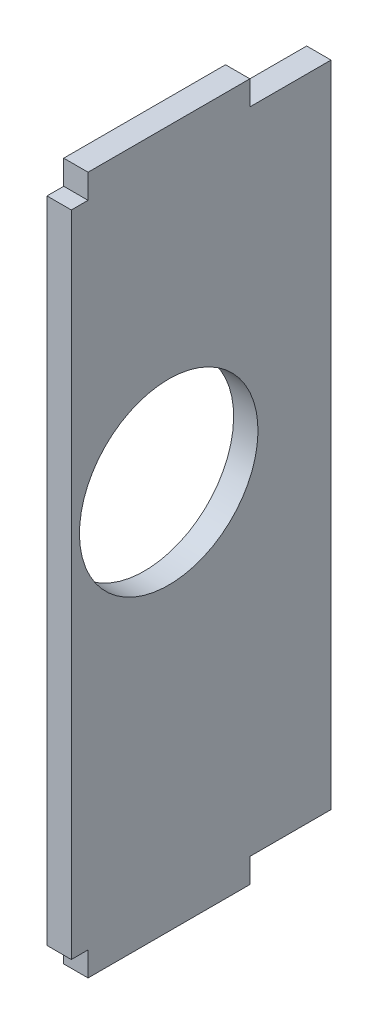
ISO-10303-21;
HEADER;
FILE_DESCRIPTION(('STEP AP214'),'2;1');
FILE_NAME('part.step','',(''),(''),'','','');
FILE_SCHEMA(('AUTOMOTIVE_DESIGN { 1 0 10303 214 1 1 1 1 }'));
ENDSEC;
DATA;
#1=APPLICATION_CONTEXT('core data for automotive mechanical design processes');
#2=APPLICATION_PROTOCOL_DEFINITION('international standard','automotive_design',2000,#1);
#3=PRODUCT_CONTEXT('',#1,'mechanical');
#4=PRODUCT('Part','Part','',(#3));
#5=PRODUCT_RELATED_PRODUCT_CATEGORY('part','',(#4));
#6=PRODUCT_DEFINITION_FORMATION('','',#4);
#7=PRODUCT_DEFINITION_CONTEXT('part definition',#1,'design');
#8=PRODUCT_DEFINITION('design','',#6,#7);
#9=PRODUCT_DEFINITION_SHAPE('','',#8);
#10=(LENGTH_UNIT() NAMED_UNIT(*) SI_UNIT(.MILLI.,.METRE.));
#11=(NAMED_UNIT(*) PLANE_ANGLE_UNIT() SI_UNIT($,.RADIAN.));
#12=(NAMED_UNIT(*) SI_UNIT($,.STERADIAN.) SOLID_ANGLE_UNIT());
#13=UNCERTAINTY_MEASURE_WITH_UNIT(LENGTH_MEASURE(1.E-05),#10,'distance_accuracy_value','');
#14=(GEOMETRIC_REPRESENTATION_CONTEXT(3) GLOBAL_UNCERTAINTY_ASSIGNED_CONTEXT((#13)) GLOBAL_UNIT_ASSIGNED_CONTEXT((#10,
#11,#12)) REPRESENTATION_CONTEXT('',''));
#15=CARTESIAN_POINT('',(0.,0.,0.));
#16=DIRECTION('',(0.,0.,1.));
#17=DIRECTION('',(1.,0.,0.));
#18=AXIS2_PLACEMENT_3D('',#15,#16,#17);
#19=CARTESIAN_POINT('',(-3.,-40.,-6.79150579150582));
#20=DIRECTION('',(0.,0.,-1.));
#21=DIRECTION('',(-1.,0.,0.));
#22=AXIS2_PLACEMENT_3D('',#19,#20,#21);
#23=PLANE('',#22);
#24=DIRECTION('',(0.,1.,0.));
#25=VECTOR('',#24,1.);
#26=CARTESIAN_POINT('',(0.,-40.,-6.79150579150582));
#27=LINE('',#26,#25);
#28=CARTESIAN_POINT('',(0.,-40.,-6.79150579150582));
#29=VERTEX_POINT('',#28);
#30=CARTESIAN_POINT('',(0.,40.,-6.79150579150582));
#31=VERTEX_POINT('',#30);
#32=EDGE_CURVE('E149',#29,#31,#27,.T.);
#33=ORIENTED_EDGE('',*,*,#32,.F.);
#34=DIRECTION('',(1.,0.,0.));
#35=VECTOR('',#34,1.);
#36=CARTESIAN_POINT('',(-3.,-40.,-6.79150579150582));
#37=LINE('',#36,#35);
#38=CARTESIAN_POINT('',(-3.,-40.,-6.79150579150582));
#39=VERTEX_POINT('',#38);
#40=EDGE_CURVE('E32',#39,#29,#37,.T.);
#41=ORIENTED_EDGE('',*,*,#40,.F.);
#42=DIRECTION('',(0.,1.,0.));
#43=VECTOR('',#42,1.);
#44=CARTESIAN_POINT('',(-3.,-40.,-6.79150579150582));
#45=LINE('',#44,#43);
#46=CARTESIAN_POINT('',(-3.,40.,-6.79150579150582));
#47=VERTEX_POINT('',#46);
#48=EDGE_CURVE('E138',#39,#47,#45,.T.);
#49=ORIENTED_EDGE('',*,*,#48,.T.);
#50=DIRECTION('',(1.,0.,0.));
#51=VECTOR('',#50,1.);
#52=CARTESIAN_POINT('',(-3.,40.,-6.79150579150582));
#53=LINE('',#52,#51);
#54=EDGE_CURVE('E10',#47,#31,#53,.T.);
#55=ORIENTED_EDGE('',*,*,#54,.T.);
#56=EDGE_LOOP('',(#33,#41,#49,#55));
#57=FACE_BOUND('',#56,.T.);
#58=ADVANCED_FACE('F16',(#57),#23,.T.);
#59=CARTESIAN_POINT('',(-3.,40.,-6.79150579150582));
#60=DIRECTION('',(0.,1.,0.));
#61=DIRECTION('',(0.,0.,1.));
#62=AXIS2_PLACEMENT_3D('',#59,#60,#61);
#63=PLANE('',#62);
#64=DIRECTION('',(0.,0.,1.));
#65=VECTOR('',#64,1.);
#66=CARTESIAN_POINT('',(0.,40.,-6.79150579150582));
#67=LINE('',#66,#65);
#68=CARTESIAN_POINT('',(0.,40.,3.2084942084942));
#69=VERTEX_POINT('',#68);
#70=EDGE_CURVE('E144',#31,#69,#67,.T.);
#71=ORIENTED_EDGE('',*,*,#70,.F.);
#72=ORIENTED_EDGE('',*,*,#54,.F.);
#73=DIRECTION('',(0.,0.,1.));
#74=VECTOR('',#73,1.);
#75=CARTESIAN_POINT('',(-3.,40.,-6.79150579150582));
#76=LINE('',#75,#74);
#77=CARTESIAN_POINT('',(-3.,40.,3.2084942084942));
#78=VERTEX_POINT('',#77);
#79=EDGE_CURVE('E140',#47,#78,#76,.T.);
#80=ORIENTED_EDGE('',*,*,#79,.T.);
#81=DIRECTION('',(1.,0.,0.));
#82=VECTOR('',#81,1.);
#83=CARTESIAN_POINT('',(-3.,40.,3.2084942084942));
#84=LINE('',#83,#82);
#85=EDGE_CURVE('E24',#78,#69,#84,.T.);
#86=ORIENTED_EDGE('',*,*,#85,.T.);
#87=EDGE_LOOP('',(#71,#72,#80,#86));
#88=FACE_BOUND('',#87,.T.);
#89=ADVANCED_FACE('F206',(#88),#63,.T.);
#90=CARTESIAN_POINT('',(-3.,40.,3.2084942084942));
#91=DIRECTION('',(0.,0.,-1.));
#92=DIRECTION('',(-1.,0.,0.));
#93=AXIS2_PLACEMENT_3D('',#90,#91,#92);
#94=PLANE('',#93);
#95=DIRECTION('',(0.,1.,0.));
#96=VECTOR('',#95,1.);
#97=CARTESIAN_POINT('',(0.,40.,3.2084942084942));
#98=LINE('',#97,#96);
#99=CARTESIAN_POINT('',(0.,43.,3.2084942084942));
#100=VERTEX_POINT('',#99);
#101=EDGE_CURVE('E148',#69,#100,#98,.T.);
#102=ORIENTED_EDGE('',*,*,#101,.F.);
#103=ORIENTED_EDGE('',*,*,#85,.F.);
#104=DIRECTION('',(0.,1.,0.));
#105=VECTOR('',#104,1.);
#106=CARTESIAN_POINT('',(-3.,40.,3.2084942084942));
#107=LINE('',#106,#105);
#108=CARTESIAN_POINT('',(-3.,43.,3.2084942084942));
#109=VERTEX_POINT('',#108);
#110=EDGE_CURVE('E216',#78,#109,#107,.T.);
#111=ORIENTED_EDGE('',*,*,#110,.T.);
#112=DIRECTION('',(1.,0.,0.));
#113=VECTOR('',#112,1.);
#114=CARTESIAN_POINT('',(-3.,43.,3.2084942084942));
#115=LINE('',#114,#113);
#116=EDGE_CURVE('E204',#109,#100,#115,.T.);
#117=ORIENTED_EDGE('',*,*,#116,.T.);
#118=EDGE_LOOP('',(#102,#103,#111,#117));
#119=FACE_BOUND('',#118,.T.);
#120=ADVANCED_FACE('F210',(#119),#94,.T.);
#121=CARTESIAN_POINT('',(-3.,43.,3.2084942084942));
#122=DIRECTION('',(0.,1.,0.));
#123=DIRECTION('',(0.,0.,1.));
#124=AXIS2_PLACEMENT_3D('',#121,#122,#123);
#125=PLANE('',#124);
#126=DIRECTION('',(0.,0.,1.));
#127=VECTOR('',#126,1.);
#128=CARTESIAN_POINT('',(0.,43.,3.2084942084942));
#129=LINE('',#128,#127);
#130=CARTESIAN_POINT('',(0.,43.,23.1484942084942));
#131=VERTEX_POINT('',#130);
#132=EDGE_CURVE('E153',#100,#131,#129,.T.);
#133=ORIENTED_EDGE('',*,*,#132,.F.);
#134=ORIENTED_EDGE('',*,*,#116,.F.);
#135=DIRECTION('',(0.,0.,1.));
#136=VECTOR('',#135,1.);
#137=CARTESIAN_POINT('',(-3.,43.,3.2084942084942));
#138=LINE('',#137,#136);
#139=CARTESIAN_POINT('',(-3.,43.,23.1484942084942));
#140=VERTEX_POINT('',#139);
#141=EDGE_CURVE('E218',#109,#140,#138,.T.);
#142=ORIENTED_EDGE('',*,*,#141,.T.);
#143=DIRECTION('',(1.,0.,0.));
#144=VECTOR('',#143,1.);
#145=CARTESIAN_POINT('',(-3.,43.,23.1484942084942));
#146=LINE('',#145,#144);
#147=EDGE_CURVE('E202',#140,#131,#146,.T.);
#148=ORIENTED_EDGE('',*,*,#147,.T.);
#149=EDGE_LOOP('',(#133,#134,#142,#148));
#150=FACE_BOUND('',#149,.T.);
#151=ADVANCED_FACE('F254',(#150),#125,.T.);
#152=CARTESIAN_POINT('',(-3.,43.,23.1484942084942));
#153=DIRECTION('',(0.,0.,1.));
#154=DIRECTION('',(1.,0.,0.));
#155=AXIS2_PLACEMENT_3D('',#152,#153,#154);
#156=PLANE('',#155);
#157=DIRECTION('',(0.,-1.,0.));
#158=VECTOR('',#157,1.);
#159=CARTESIAN_POINT('',(0.,43.,23.1484942084942));
#160=LINE('',#159,#158);
#161=CARTESIAN_POINT('',(0.,40.,23.1484942084942));
#162=VERTEX_POINT('',#161);
#163=EDGE_CURVE('E157',#131,#162,#160,.T.);
#164=ORIENTED_EDGE('',*,*,#163,.F.);
#165=ORIENTED_EDGE('',*,*,#147,.F.);
#166=DIRECTION('',(0.,-1.,0.));
#167=VECTOR('',#166,1.);
#168=CARTESIAN_POINT('',(-3.,43.,23.1484942084942));
#169=LINE('',#168,#167);
#170=CARTESIAN_POINT('',(-3.,40.,23.1484942084942));
#171=VERTEX_POINT('',#170);
#172=EDGE_CURVE('E223',#140,#171,#169,.T.);
#173=ORIENTED_EDGE('',*,*,#172,.T.);
#174=DIRECTION('',(1.,0.,0.));
#175=VECTOR('',#174,1.);
#176=CARTESIAN_POINT('',(-3.,40.,23.1484942084942));
#177=LINE('',#176,#175);
#178=EDGE_CURVE('E200',#171,#162,#177,.T.);
#179=ORIENTED_EDGE('',*,*,#178,.T.);
#180=EDGE_LOOP('',(#164,#165,#173,#179));
#181=FACE_BOUND('',#180,.T.);
#182=ADVANCED_FACE('F252',(#181),#156,.T.);
#183=CARTESIAN_POINT('',(-3.,40.,23.1484942084942));
#184=DIRECTION('',(0.,1.,0.));
#185=DIRECTION('',(0.,0.,1.));
#186=AXIS2_PLACEMENT_3D('',#183,#184,#185);
#187=PLANE('',#186);
#188=DIRECTION('',(0.,0.,1.));
#189=VECTOR('',#188,1.);
#190=CARTESIAN_POINT('',(0.,40.,23.1484942084942));
#191=LINE('',#190,#189);
#192=CARTESIAN_POINT('',(0.,40.,25.2084942084942));
#193=VERTEX_POINT('',#192);
#194=EDGE_CURVE('E161',#162,#193,#191,.T.);
#195=ORIENTED_EDGE('',*,*,#194,.F.);
#196=ORIENTED_EDGE('',*,*,#178,.F.);
#197=DIRECTION('',(0.,0.,1.));
#198=VECTOR('',#197,1.);
#199=CARTESIAN_POINT('',(-3.,40.,23.1484942084942));
#200=LINE('',#199,#198);
#201=CARTESIAN_POINT('',(-3.,40.,25.2084942084942));
#202=VERTEX_POINT('',#201);
#203=EDGE_CURVE('E226',#171,#202,#200,.T.);
#204=ORIENTED_EDGE('',*,*,#203,.T.);
#205=DIRECTION('',(1.,0.,0.));
#206=VECTOR('',#205,1.);
#207=CARTESIAN_POINT('',(-3.,40.,25.2084942084942));
#208=LINE('',#207,#206);
#209=EDGE_CURVE('E198',#202,#193,#208,.T.);
#210=ORIENTED_EDGE('',*,*,#209,.T.);
#211=EDGE_LOOP('',(#195,#196,#204,#210));
#212=FACE_BOUND('',#211,.T.);
#213=ADVANCED_FACE('F248',(#212),#187,.T.);
#214=CARTESIAN_POINT('',(-3.,40.,25.2084942084942));
#215=DIRECTION('',(0.,0.,1.));
#216=DIRECTION('',(0.,-1.,0.));
#217=AXIS2_PLACEMENT_3D('',#214,#215,#216);
#218=PLANE('',#217);
#219=DIRECTION('',(0.,-1.,0.));
#220=VECTOR('',#219,1.);
#221=CARTESIAN_POINT('',(0.,40.,25.2084942084942));
#222=LINE('',#221,#220);
#223=CARTESIAN_POINT('',(0.,-40.,25.2084942084942));
#224=VERTEX_POINT('',#223);
#225=EDGE_CURVE('E165',#193,#224,#222,.T.);
#226=ORIENTED_EDGE('',*,*,#225,.F.);
#227=ORIENTED_EDGE('',*,*,#209,.F.);
#228=DIRECTION('',(0.,-1.,0.));
#229=VECTOR('',#228,1.);
#230=CARTESIAN_POINT('',(-3.,40.,25.2084942084942));
#231=LINE('',#230,#229);
#232=CARTESIAN_POINT('',(-3.,-40.,25.2084942084942));
#233=VERTEX_POINT('',#232);
#234=EDGE_CURVE('E229',#202,#233,#231,.T.);
#235=ORIENTED_EDGE('',*,*,#234,.T.);
#236=DIRECTION('',(1.,0.,0.));
#237=VECTOR('',#236,1.);
#238=CARTESIAN_POINT('',(-3.,-40.,25.2084942084942));
#239=LINE('',#238,#237);
#240=EDGE_CURVE('E196',#233,#224,#239,.T.);
#241=ORIENTED_EDGE('',*,*,#240,.T.);
#242=EDGE_LOOP('',(#226,#227,#235,#241));
#243=FACE_BOUND('',#242,.T.);
#244=ADVANCED_FACE('F245',(#243),#218,.T.);
#245=CARTESIAN_POINT('',(-3.,-40.,25.2084942084942));
#246=DIRECTION('',(0.,-1.,0.));
#247=DIRECTION('',(0.,0.,-1.));
#248=AXIS2_PLACEMENT_3D('',#245,#246,#247);
#249=PLANE('',#248);
#250=DIRECTION('',(0.,0.,-1.));
#251=VECTOR('',#250,1.);
#252=CARTESIAN_POINT('',(0.,-40.,25.2084942084942));
#253=LINE('',#252,#251);
#254=CARTESIAN_POINT('',(0.,-40.,23.1484942084942));
#255=VERTEX_POINT('',#254);
#256=EDGE_CURVE('E169',#224,#255,#253,.T.);
#257=ORIENTED_EDGE('',*,*,#256,.F.);
#258=ORIENTED_EDGE('',*,*,#240,.F.);
#259=DIRECTION('',(0.,0.,-1.));
#260=VECTOR('',#259,1.);
#261=CARTESIAN_POINT('',(-3.,-40.,25.2084942084942));
#262=LINE('',#261,#260);
#263=CARTESIAN_POINT('',(-3.,-40.,23.1484942084942));
#264=VERTEX_POINT('',#263);
#265=EDGE_CURVE('E232',#233,#264,#262,.T.);
#266=ORIENTED_EDGE('',*,*,#265,.T.);
#267=DIRECTION('',(1.,0.,0.));
#268=VECTOR('',#267,1.);
#269=CARTESIAN_POINT('',(-3.,-40.,23.1484942084942));
#270=LINE('',#269,#268);
#271=EDGE_CURVE('E194',#264,#255,#270,.T.);
#272=ORIENTED_EDGE('',*,*,#271,.T.);
#273=EDGE_LOOP('',(#257,#258,#266,#272));
#274=FACE_BOUND('',#273,.T.);
#275=ADVANCED_FACE('F242',(#274),#249,.T.);
#276=CARTESIAN_POINT('',(-3.,-40.,23.1484942084942));
#277=DIRECTION('',(0.,0.,1.));
#278=DIRECTION('',(1.,0.,0.));
#279=AXIS2_PLACEMENT_3D('',#276,#277,#278);
#280=PLANE('',#279);
#281=DIRECTION('',(0.,-1.,0.));
#282=VECTOR('',#281,1.);
#283=CARTESIAN_POINT('',(0.,-40.,23.1484942084942));
#284=LINE('',#283,#282);
#285=CARTESIAN_POINT('',(0.,-43.,23.1484942084942));
#286=VERTEX_POINT('',#285);
#287=EDGE_CURVE('E173',#255,#286,#284,.T.);
#288=ORIENTED_EDGE('',*,*,#287,.F.);
#289=ORIENTED_EDGE('',*,*,#271,.F.);
#290=DIRECTION('',(0.,-1.,0.));
#291=VECTOR('',#290,1.);
#292=CARTESIAN_POINT('',(-3.,-40.,23.1484942084942));
#293=LINE('',#292,#291);
#294=CARTESIAN_POINT('',(-3.,-43.,23.1484942084942));
#295=VERTEX_POINT('',#294);
#296=EDGE_CURVE('E127',#264,#295,#293,.T.);
#297=ORIENTED_EDGE('',*,*,#296,.T.);
#298=DIRECTION('',(1.,0.,0.));
#299=VECTOR('',#298,1.);
#300=CARTESIAN_POINT('',(-3.,-43.,23.1484942084942));
#301=LINE('',#300,#299);
#302=EDGE_CURVE('E119',#295,#286,#301,.T.);
#303=ORIENTED_EDGE('',*,*,#302,.T.);
#304=EDGE_LOOP('',(#288,#289,#297,#303));
#305=FACE_BOUND('',#304,.T.);
#306=ADVANCED_FACE('F236',(#305),#280,.T.);
#307=CARTESIAN_POINT('',(-3.,-43.,23.1484942084942));
#308=DIRECTION('',(0.,-1.,0.));
#309=DIRECTION('',(0.,0.,-1.));
#310=AXIS2_PLACEMENT_3D('',#307,#308,#309);
#311=PLANE('',#310);
#312=DIRECTION('',(0.,0.,-1.));
#313=VECTOR('',#312,1.);
#314=CARTESIAN_POINT('',(0.,-43.,23.1484942084942));
#315=LINE('',#314,#313);
#316=CARTESIAN_POINT('',(0.,-43.,3.20849420849419));
#317=VERTEX_POINT('',#316);
#318=EDGE_CURVE('E177',#286,#317,#315,.T.);
#319=ORIENTED_EDGE('',*,*,#318,.F.);
#320=ORIENTED_EDGE('',*,*,#302,.F.);
#321=DIRECTION('',(0.,0.,-1.));
#322=VECTOR('',#321,1.);
#323=CARTESIAN_POINT('',(-3.,-43.,23.1484942084942));
#324=LINE('',#323,#322);
#325=CARTESIAN_POINT('',(-3.,-43.,3.20849420849419));
#326=VERTEX_POINT('',#325);
#327=EDGE_CURVE('E122',#295,#326,#324,.T.);
#328=ORIENTED_EDGE('',*,*,#327,.T.);
#329=DIRECTION('',(1.,0.,0.));
#330=VECTOR('',#329,1.);
#331=CARTESIAN_POINT('',(-3.,-43.,3.20849420849419));
#332=LINE('',#331,#330);
#333=EDGE_CURVE('E108',#326,#317,#332,.T.);
#334=ORIENTED_EDGE('',*,*,#333,.T.);
#335=EDGE_LOOP('',(#319,#320,#328,#334));
#336=FACE_BOUND('',#335,.T.);
#337=ADVANCED_FACE('F123',(#336),#311,.T.);
#338=CARTESIAN_POINT('',(-3.,-43.,3.20849420849418));
#339=DIRECTION('',(0.,0.,-1.));
#340=DIRECTION('',(-1.,0.,0.));
#341=AXIS2_PLACEMENT_3D('',#338,#339,#340);
#342=PLANE('',#341);
#343=DIRECTION('',(0.,1.,0.));
#344=VECTOR('',#343,1.);
#345=CARTESIAN_POINT('',(0.,-43.,3.20849420849418));
#346=LINE('',#345,#344);
#347=CARTESIAN_POINT('',(0.,-40.,3.20849420849418));
#348=VERTEX_POINT('',#347);
#349=EDGE_CURVE('E115',#317,#348,#346,.T.);
#350=ORIENTED_EDGE('',*,*,#349,.F.);
#351=ORIENTED_EDGE('',*,*,#333,.F.);
#352=DIRECTION('',(0.,1.,0.));
#353=VECTOR('',#352,1.);
#354=CARTESIAN_POINT('',(-3.,-43.,3.20849420849418));
#355=LINE('',#354,#353);
#356=CARTESIAN_POINT('',(-3.,-40.,3.20849420849418));
#357=VERTEX_POINT('',#356);
#358=EDGE_CURVE('E112',#326,#357,#355,.T.);
#359=ORIENTED_EDGE('',*,*,#358,.T.);
#360=DIRECTION('',(1.,0.,0.));
#361=VECTOR('',#360,1.);
#362=CARTESIAN_POINT('',(-3.,-40.,3.20849420849418));
#363=LINE('',#362,#361);
#364=EDGE_CURVE('E72',#357,#348,#363,.T.);
#365=ORIENTED_EDGE('',*,*,#364,.T.);
#366=EDGE_LOOP('',(#350,#351,#359,#365));
#367=FACE_BOUND('',#366,.T.);
#368=ADVANCED_FACE('F110',(#367),#342,.T.);
#369=CARTESIAN_POINT('',(-3.,-40.,3.20849420849418));
#370=DIRECTION('',(0.,-1.,0.));
#371=DIRECTION('',(0.,0.,-1.));
#372=AXIS2_PLACEMENT_3D('',#369,#370,#371);
#373=PLANE('',#372);
#374=DIRECTION('',(0.,0.,-1.));
#375=VECTOR('',#374,1.);
#376=CARTESIAN_POINT('',(0.,-40.,3.20849420849418));
#377=LINE('',#376,#375);
#378=EDGE_CURVE('E182',#348,#29,#377,.T.);
#379=ORIENTED_EDGE('',*,*,#378,.F.);
#380=ORIENTED_EDGE('',*,*,#364,.F.);
#381=DIRECTION('',(0.,0.,-1.));
#382=VECTOR('',#381,1.);
#383=CARTESIAN_POINT('',(-3.,-40.,3.20849420849418));
#384=LINE('',#383,#382);
#385=EDGE_CURVE('E132',#357,#39,#384,.T.);
#386=ORIENTED_EDGE('',*,*,#385,.T.);
#387=ORIENTED_EDGE('',*,*,#40,.T.);
#388=EDGE_LOOP('',(#379,#380,#386,#387));
#389=FACE_BOUND('',#388,.T.);
#390=ADVANCED_FACE('F346',(#389),#373,.T.);
#391=CARTESIAN_POINT('',(-3.,4.95999999999999,13.2084942084942));
#392=DIRECTION('',(1.,0.,0.));
#393=DIRECTION('',(0.,0.,-1.));
#394=AXIS2_PLACEMENT_3D('',#391,#392,#393);
#395=CYLINDRICAL_SURFACE('',#394,11.);
#396=CARTESIAN_POINT('',(-3.,4.95999999999999,13.2084942084942));
#397=DIRECTION('',(-1.,0.,0.));
#398=DIRECTION('',(0.,1.,0.));
#399=AXIS2_PLACEMENT_3D('',#396,#397,#398);
#400=CIRCLE('',#399,11.);
#401=CARTESIAN_POINT('',(-3.,15.96,13.2084942084942));
#402=VERTEX_POINT('',#401);
#403=EDGE_CURVE('E134',#402,#402,#400,.T.);
#404=ORIENTED_EDGE('',*,*,#403,.T.);
#405=EDGE_LOOP('',(#404));
#406=FACE_BOUND('',#405,.T.);
#407=CARTESIAN_POINT('',(0.,4.95999999999999,13.2084942084942));
#408=DIRECTION('',(-1.,0.,0.));
#409=DIRECTION('',(0.,1.,0.));
#410=AXIS2_PLACEMENT_3D('',#407,#408,#409);
#411=CIRCLE('',#410,11.);
#412=CARTESIAN_POINT('',(0.,15.96,13.2084942084942));
#413=VERTEX_POINT('',#412);
#414=EDGE_CURVE('E141',#413,#413,#411,.T.);
#415=ORIENTED_EDGE('',*,*,#414,.F.);
#416=EDGE_LOOP('',(#415));
#417=FACE_BOUND('',#416,.T.);
#418=ADVANCED_FACE('F356',(#406,#417),#395,.F.);
#419=CARTESIAN_POINT('',(-3.,0.,0.));
#420=DIRECTION('',(1.,0.,0.));
#421=DIRECTION('',(0.,1.,0.));
#422=AXIS2_PLACEMENT_3D('',#419,#420,#421);
#423=PLANE('',#422);
#424=ORIENTED_EDGE('',*,*,#48,.F.);
#425=ORIENTED_EDGE('',*,*,#385,.F.);
#426=ORIENTED_EDGE('',*,*,#358,.F.);
#427=ORIENTED_EDGE('',*,*,#327,.F.);
#428=ORIENTED_EDGE('',*,*,#296,.F.);
#429=ORIENTED_EDGE('',*,*,#265,.F.);
#430=ORIENTED_EDGE('',*,*,#234,.F.);
#431=ORIENTED_EDGE('',*,*,#203,.F.);
#432=ORIENTED_EDGE('',*,*,#172,.F.);
#433=ORIENTED_EDGE('',*,*,#141,.F.);
#434=ORIENTED_EDGE('',*,*,#110,.F.);
#435=ORIENTED_EDGE('',*,*,#79,.F.);
#436=EDGE_LOOP('',(#424,#425,#426,#427,#428,#429,#430,#431,#432,#433,#434,#435));
#437=FACE_BOUND('',#436,.T.);
#438=ORIENTED_EDGE('',*,*,#403,.F.);
#439=EDGE_LOOP('',(#438));
#440=FACE_BOUND('',#439,.T.);
#441=ADVANCED_FACE('F130',(#437,#440),#423,.F.);
#442=CARTESIAN_POINT('',(0.,0.,0.));
#443=DIRECTION('',(1.,0.,0.));
#444=DIRECTION('',(0.,1.,0.));
#445=AXIS2_PLACEMENT_3D('',#442,#443,#444);
#446=PLANE('',#445);
#447=ORIENTED_EDGE('',*,*,#32,.T.);
#448=ORIENTED_EDGE('',*,*,#70,.T.);
#449=ORIENTED_EDGE('',*,*,#101,.T.);
#450=ORIENTED_EDGE('',*,*,#132,.T.);
#451=ORIENTED_EDGE('',*,*,#163,.T.);
#452=ORIENTED_EDGE('',*,*,#194,.T.);
#453=ORIENTED_EDGE('',*,*,#225,.T.);
#454=ORIENTED_EDGE('',*,*,#256,.T.);
#455=ORIENTED_EDGE('',*,*,#287,.T.);
#456=ORIENTED_EDGE('',*,*,#318,.T.);
#457=ORIENTED_EDGE('',*,*,#349,.T.);
#458=ORIENTED_EDGE('',*,*,#378,.T.);
#459=EDGE_LOOP('',(#447,#448,#449,#450,#451,#452,#453,#454,#455,#456,#457,#458));
#460=FACE_BOUND('',#459,.T.);
#461=ORIENTED_EDGE('',*,*,#414,.T.);
#462=EDGE_LOOP('',(#461));
#463=FACE_BOUND('',#462,.T.);
#464=ADVANCED_FACE('F213',(#460,#463),#446,.T.);
#465=CLOSED_SHELL('',(#58,#89,#120,#151,#182,#213,#244,#275,#306,#337,#368,#390,#418,#441,#464));
#466=MANIFOLD_SOLID_BREP('B1',#465);
#467=ADVANCED_BREP_SHAPE_REPRESENTATION('',(#18,#466),#14);
#468=SHAPE_DEFINITION_REPRESENTATION(#9,#467);
ENDSEC;
END-ISO-10303-21;
